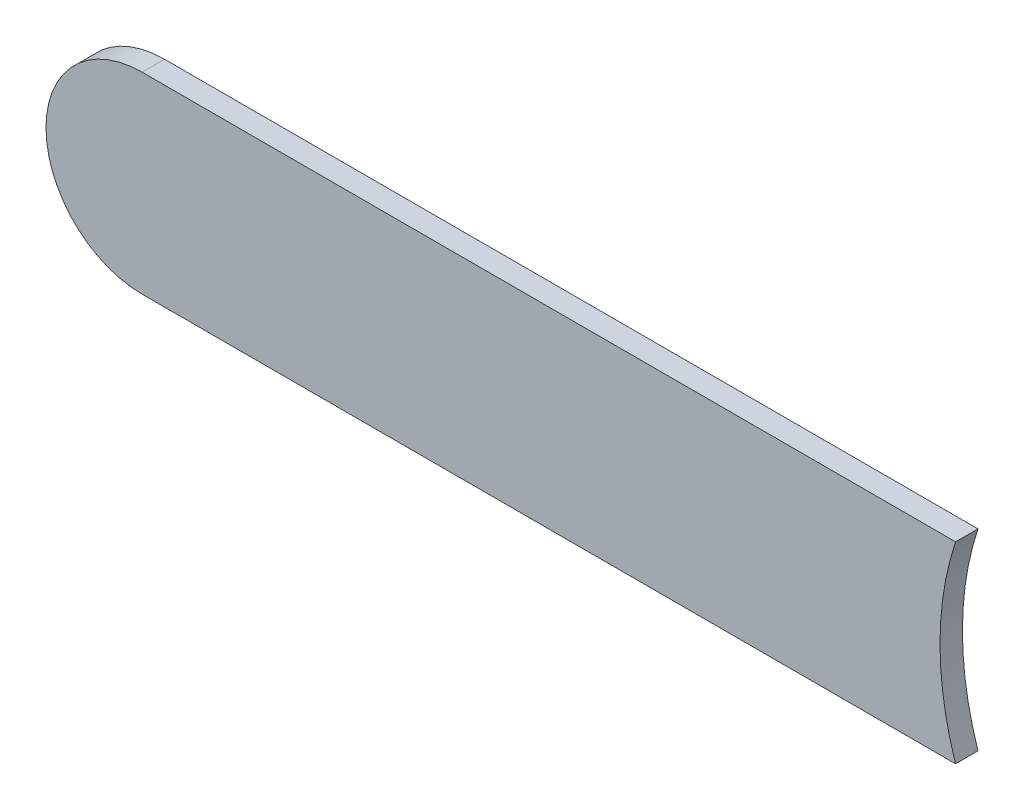
ISO-10303-21;
HEADER;
FILE_DESCRIPTION(('STEP AP214'),'2;1');
FILE_NAME('part.step','',(''),(''),'','','');
FILE_SCHEMA(('AUTOMOTIVE_DESIGN { 1 0 10303 214 1 1 1 1 }'));
ENDSEC;
DATA;
#1=APPLICATION_CONTEXT('core data for automotive mechanical design processes');
#2=APPLICATION_PROTOCOL_DEFINITION('international standard','automotive_design',2000,#1);
#3=PRODUCT_CONTEXT('',#1,'mechanical');
#4=PRODUCT('Part','Part','',(#3));
#5=PRODUCT_RELATED_PRODUCT_CATEGORY('part','',(#4));
#6=PRODUCT_DEFINITION_FORMATION('','',#4);
#7=PRODUCT_DEFINITION_CONTEXT('part definition',#1,'design');
#8=PRODUCT_DEFINITION('design','',#6,#7);
#9=PRODUCT_DEFINITION_SHAPE('','',#8);
#10=(LENGTH_UNIT() NAMED_UNIT(*) SI_UNIT(.MILLI.,.METRE.));
#11=(NAMED_UNIT(*) PLANE_ANGLE_UNIT() SI_UNIT($,.RADIAN.));
#12=(NAMED_UNIT(*) SI_UNIT($,.STERADIAN.) SOLID_ANGLE_UNIT());
#13=UNCERTAINTY_MEASURE_WITH_UNIT(LENGTH_MEASURE(1.E-05),#10,'distance_accuracy_value','');
#14=(GEOMETRIC_REPRESENTATION_CONTEXT(3) GLOBAL_UNCERTAINTY_ASSIGNED_CONTEXT((#13)) GLOBAL_UNIT_ASSIGNED_CONTEXT((#10,
#11,#12)) REPRESENTATION_CONTEXT('',''));
#15=CARTESIAN_POINT('',(0.,0.,0.));
#16=DIRECTION('',(0.,0.,1.));
#17=DIRECTION('',(1.,0.,0.));
#18=AXIS2_PLACEMENT_3D('',#15,#16,#17);
#19=CARTESIAN_POINT('',(78.725,-109.225,1.6));
#20=DIRECTION('',(0.,-1.,0.));
#21=DIRECTION('',(0.,0.,-1.));
#22=AXIS2_PLACEMENT_3D('',#19,#20,#21);
#23=PLANE('',#22);
#24=DIRECTION('',(0.,0.,1.));
#25=VECTOR('',#24,1.);
#26=CARTESIAN_POINT('',(77.005,-109.225,1.6));
#27=LINE('',#26,#25);
#28=CARTESIAN_POINT('',(77.005,-109.225,1.6));
#29=VERTEX_POINT('',#28);
#30=CARTESIAN_POINT('',(77.005,-109.225,1.635));
#31=VERTEX_POINT('',#30);
#32=EDGE_CURVE('E11',#29,#31,#27,.T.);
#33=ORIENTED_EDGE('',*,*,#32,.T.);
#34=DIRECTION('',(-1.,0.,0.));
#35=VECTOR('',#34,1.);
#36=CARTESIAN_POINT('',(78.725,-109.225,1.635));
#37=LINE('',#36,#35);
#38=CARTESIAN_POINT('',(78.274306090567,-109.225,1.635));
#39=VERTEX_POINT('',#38);
#40=EDGE_CURVE('E20',#39,#31,#37,.T.);
#41=ORIENTED_EDGE('',*,*,#40,.F.);
#42=DIRECTION('',(0.,0.,-1.));
#43=VECTOR('',#42,1.);
#44=CARTESIAN_POINT('',(78.274306090567,-109.225,-0.045));
#45=LINE('',#44,#43);
#46=CARTESIAN_POINT('',(78.274306090567,-109.225,1.6));
#47=VERTEX_POINT('',#46);
#48=EDGE_CURVE('E74',#39,#47,#45,.T.);
#49=ORIENTED_EDGE('',*,*,#48,.T.);
#50=DIRECTION('',(-1.,0.,0.));
#51=VECTOR('',#50,1.);
#52=CARTESIAN_POINT('',(78.725,-109.225,1.6));
#53=LINE('',#52,#51);
#54=EDGE_CURVE('E105',#47,#29,#53,.T.);
#55=ORIENTED_EDGE('',*,*,#54,.T.);
#56=EDGE_LOOP('',(#33,#41,#49,#55));
#57=FACE_BOUND('',#56,.T.);
#58=ADVANCED_FACE('F17',(#57),#23,.F.);
#59=CARTESIAN_POINT('',(77.005,-109.375,1.6));
#60=DIRECTION('',(0.,0.,-1.));
#61=DIRECTION('',(0.,1.,0.));
#62=AXIS2_PLACEMENT_3D('',#59,#60,#61);
#63=CYLINDRICAL_SURFACE('',#62,0.15);
#64=CARTESIAN_POINT('',(77.005,-109.375,1.6));
#65=DIRECTION('',(0.,0.,1.));
#66=DIRECTION('',(0.,1.,0.));
#67=AXIS2_PLACEMENT_3D('',#64,#65,#66);
#68=CIRCLE('',#67,0.15);
#69=CARTESIAN_POINT('',(77.005,-109.525,1.6));
#70=VERTEX_POINT('',#69);
#71=EDGE_CURVE('E77',#29,#70,#68,.T.);
#72=ORIENTED_EDGE('',*,*,#71,.T.);
#73=DIRECTION('',(0.,0.,1.));
#74=VECTOR('',#73,1.);
#75=CARTESIAN_POINT('',(77.005,-109.525,1.6));
#76=LINE('',#75,#74);
#77=CARTESIAN_POINT('',(77.005,-109.525,1.635));
#78=VERTEX_POINT('',#77);
#79=EDGE_CURVE('E88',#70,#78,#76,.T.);
#80=ORIENTED_EDGE('',*,*,#79,.T.);
#81=CARTESIAN_POINT('',(77.005,-109.375,1.635));
#82=DIRECTION('',(0.,0.,1.));
#83=DIRECTION('',(0.,1.,0.));
#84=AXIS2_PLACEMENT_3D('',#81,#82,#83);
#85=CIRCLE('',#84,0.15);
#86=EDGE_CURVE('E83',#31,#78,#85,.T.);
#87=ORIENTED_EDGE('',*,*,#86,.F.);
#88=ORIENTED_EDGE('',*,*,#32,.F.);
#89=EDGE_LOOP('',(#72,#80,#87,#88));
#90=FACE_BOUND('',#89,.T.);
#91=ADVANCED_FACE('F119',(#90),#63,.T.);
#92=CARTESIAN_POINT('',(77.005,-109.525,1.635));
#93=DIRECTION('',(0.,0.,1.));
#94=DIRECTION('',(1.,0.,0.));
#95=AXIS2_PLACEMENT_3D('',#92,#93,#94);
#96=PLANE('',#95);
#97=ORIENTED_EDGE('',*,*,#86,.T.);
#98=DIRECTION('',(1.,0.,0.));
#99=VECTOR('',#98,1.);
#100=CARTESIAN_POINT('',(77.005,-109.525,1.635));
#101=LINE('',#100,#99);
#102=CARTESIAN_POINT('',(78.274306090562,-109.525,1.635));
#103=VERTEX_POINT('',#102);
#104=EDGE_CURVE('E80',#78,#103,#101,.T.);
#105=ORIENTED_EDGE('',*,*,#104,.T.);
#106=CARTESIAN_POINT('',(78.725,-109.375,1.635));
#107=DIRECTION('',(0.,0.,-1.));
#108=DIRECTION('',(0.,-1.,0.));
#109=AXIS2_PLACEMENT_3D('',#106,#107,#108);
#110=CIRCLE('',#109,0.475);
#111=EDGE_CURVE('E68',#103,#39,#110,.T.);
#112=ORIENTED_EDGE('',*,*,#111,.T.);
#113=ORIENTED_EDGE('',*,*,#40,.T.);
#114=EDGE_LOOP('',(#97,#105,#112,#113));
#115=FACE_BOUND('',#114,.T.);
#116=ADVANCED_FACE('F81',(#115),#96,.T.);
#117=CARTESIAN_POINT('',(78.725,-109.375,-0.045));
#118=DIRECTION('',(0.,0.,-1.));
#119=DIRECTION('',(0.,-1.,0.));
#120=AXIS2_PLACEMENT_3D('',#117,#118,#119);
#121=CYLINDRICAL_SURFACE('',#120,0.475);
#122=ORIENTED_EDGE('',*,*,#111,.F.);
#123=DIRECTION('',(0.,0.,-1.));
#124=VECTOR('',#123,1.);
#125=CARTESIAN_POINT('',(78.274306090567,-109.525,-0.045));
#126=LINE('',#125,#124);
#127=CARTESIAN_POINT('',(78.274306090562,-109.525,1.6));
#128=VERTEX_POINT('',#127);
#129=EDGE_CURVE('E73',#103,#128,#126,.T.);
#130=ORIENTED_EDGE('',*,*,#129,.T.);
#131=CARTESIAN_POINT('',(78.725,-109.375,1.6));
#132=DIRECTION('',(0.,0.,-1.));
#133=DIRECTION('',(0.,-1.,0.));
#134=AXIS2_PLACEMENT_3D('',#131,#132,#133);
#135=CIRCLE('',#134,0.475);
#136=EDGE_CURVE('E106',#128,#47,#135,.T.);
#137=ORIENTED_EDGE('',*,*,#136,.T.);
#138=ORIENTED_EDGE('',*,*,#48,.F.);
#139=EDGE_LOOP('',(#122,#130,#137,#138));
#140=FACE_BOUND('',#139,.T.);
#141=ADVANCED_FACE('F70',(#140),#121,.F.);
#142=CARTESIAN_POINT('',(77.005,-109.525,1.6));
#143=DIRECTION('',(0.,0.,1.));
#144=DIRECTION('',(1.,0.,0.));
#145=AXIS2_PLACEMENT_3D('',#142,#143,#144);
#146=PLANE('',#145);
#147=ORIENTED_EDGE('',*,*,#54,.F.);
#148=ORIENTED_EDGE('',*,*,#136,.F.);
#149=DIRECTION('',(1.,0.,0.));
#150=VECTOR('',#149,1.);
#151=CARTESIAN_POINT('',(77.005,-109.525,1.6));
#152=LINE('',#151,#150);
#153=EDGE_CURVE('E93',#70,#128,#152,.T.);
#154=ORIENTED_EDGE('',*,*,#153,.F.);
#155=ORIENTED_EDGE('',*,*,#71,.F.);
#156=EDGE_LOOP('',(#147,#148,#154,#155));
#157=FACE_BOUND('',#156,.T.);
#158=ADVANCED_FACE('F124',(#157),#146,.F.);
#159=CARTESIAN_POINT('',(77.005,-109.525,1.6));
#160=DIRECTION('',(0.,1.,0.));
#161=DIRECTION('',(1.,0.,0.));
#162=AXIS2_PLACEMENT_3D('',#159,#160,#161);
#163=PLANE('',#162);
#164=ORIENTED_EDGE('',*,*,#129,.F.);
#165=ORIENTED_EDGE('',*,*,#104,.F.);
#166=ORIENTED_EDGE('',*,*,#79,.F.);
#167=ORIENTED_EDGE('',*,*,#153,.T.);
#168=EDGE_LOOP('',(#164,#165,#166,#167));
#169=FACE_BOUND('',#168,.T.);
#170=ADVANCED_FACE('F91',(#169),#163,.F.);
#171=CLOSED_SHELL('',(#58,#91,#116,#141,#158,#170));
#172=MANIFOLD_SOLID_BREP('B1',#171);
#173=ADVANCED_BREP_SHAPE_REPRESENTATION('',(#18,#172),#14);
#174=SHAPE_DEFINITION_REPRESENTATION(#9,#173);
ENDSEC;
END-ISO-10303-21;
